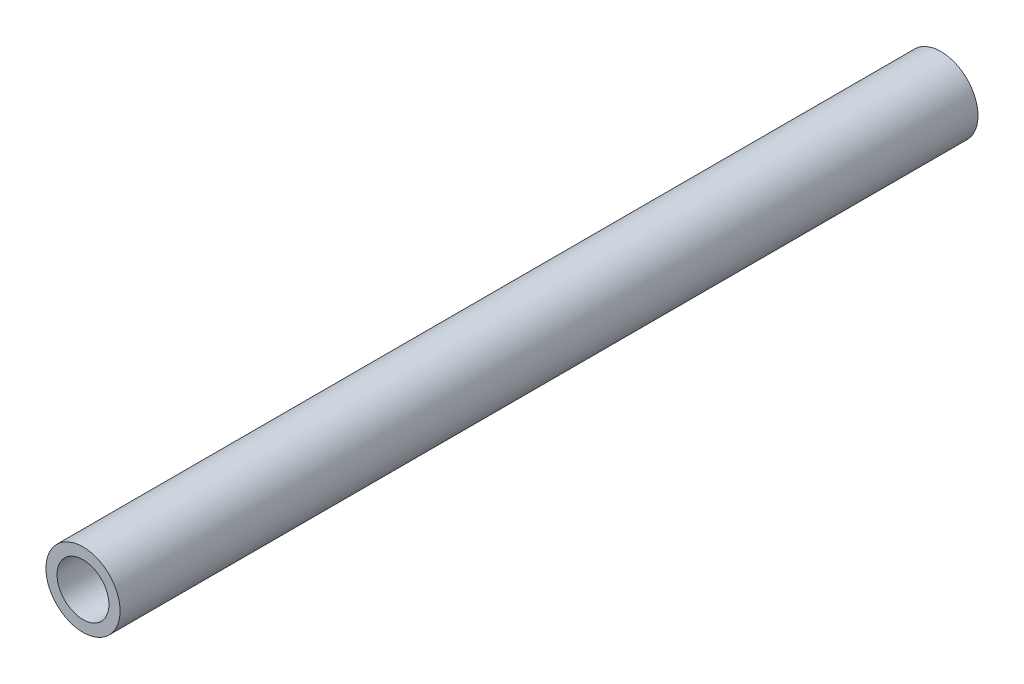
ISO-10303-21;
HEADER;
FILE_DESCRIPTION(('STEP AP214'),'2;1');
FILE_NAME('part.step','',(''),(''),'','','');
FILE_SCHEMA(('AUTOMOTIVE_DESIGN { 1 0 10303 214 1 1 1 1 }'));
ENDSEC;
DATA;
#1=APPLICATION_CONTEXT('core data for automotive mechanical design processes');
#2=APPLICATION_PROTOCOL_DEFINITION('international standard','automotive_design',2000,#1);
#3=PRODUCT_CONTEXT('',#1,'mechanical');
#4=PRODUCT('Part','Part','',(#3));
#5=PRODUCT_RELATED_PRODUCT_CATEGORY('part','',(#4));
#6=PRODUCT_DEFINITION_FORMATION('','',#4);
#7=PRODUCT_DEFINITION_CONTEXT('part definition',#1,'design');
#8=PRODUCT_DEFINITION('design','',#6,#7);
#9=PRODUCT_DEFINITION_SHAPE('','',#8);
#10=(LENGTH_UNIT() NAMED_UNIT(*) SI_UNIT(.MILLI.,.METRE.));
#11=(NAMED_UNIT(*) PLANE_ANGLE_UNIT() SI_UNIT($,.RADIAN.));
#12=(NAMED_UNIT(*) SI_UNIT($,.STERADIAN.) SOLID_ANGLE_UNIT());
#13=UNCERTAINTY_MEASURE_WITH_UNIT(LENGTH_MEASURE(1.E-05),#10,'distance_accuracy_value','');
#14=(GEOMETRIC_REPRESENTATION_CONTEXT(3) GLOBAL_UNCERTAINTY_ASSIGNED_CONTEXT((#13)) GLOBAL_UNIT_ASSIGNED_CONTEXT((#10,
#11,#12)) REPRESENTATION_CONTEXT('',''));
#15=CARTESIAN_POINT('',(0.,0.,0.));
#16=DIRECTION('',(0.,0.,1.));
#17=DIRECTION('',(1.,0.,0.));
#18=AXIS2_PLACEMENT_3D('',#15,#16,#17);
#19=CARTESIAN_POINT('',(0.,0.,294.));
#20=DIRECTION('',(0.,0.,-1.));
#21=DIRECTION('',(-1.,0.,0.));
#22=AXIS2_PLACEMENT_3D('',#19,#20,#21);
#23=CYLINDRICAL_SURFACE('',#22,12.7);
#24=CARTESIAN_POINT('',(0.,0.,294.));
#25=DIRECTION('',(0.,0.,1.));
#26=DIRECTION('',(1.,0.,0.));
#27=AXIS2_PLACEMENT_3D('',#24,#25,#26);
#28=CIRCLE('',#27,12.7);
#29=CARTESIAN_POINT('',(12.7,0.,294.));
#30=VERTEX_POINT('',#29);
#31=EDGE_CURVE('E10',#30,#30,#28,.T.);
#32=ORIENTED_EDGE('',*,*,#31,.F.);
#33=EDGE_LOOP('',(#32));
#34=FACE_BOUND('',#33,.T.);
#35=CARTESIAN_POINT('',(0.,0.,0.));
#36=DIRECTION('',(0.,0.,1.));
#37=DIRECTION('',(1.,0.,0.));
#38=AXIS2_PLACEMENT_3D('',#35,#36,#37);
#39=CIRCLE('',#38,12.7);
#40=CARTESIAN_POINT('',(12.7,0.,0.));
#41=VERTEX_POINT('',#40);
#42=EDGE_CURVE('E44',#41,#41,#39,.T.);
#43=ORIENTED_EDGE('',*,*,#42,.T.);
#44=EDGE_LOOP('',(#43));
#45=FACE_BOUND('',#44,.T.);
#46=ADVANCED_FACE('F41',(#34,#45),#23,.T.);
#47=CARTESIAN_POINT('',(0.,0.,294.));
#48=DIRECTION('',(0.,0.,1.));
#49=DIRECTION('',(1.,0.,0.));
#50=AXIS2_PLACEMENT_3D('',#47,#48,#49);
#51=PLANE('',#50);
#52=CARTESIAN_POINT('',(0.,0.,294.));
#53=DIRECTION('',(0.,0.,1.));
#54=DIRECTION('',(1.,0.,0.));
#55=AXIS2_PLACEMENT_3D('',#52,#53,#54);
#56=CIRCLE('',#55,8.89);
#57=CARTESIAN_POINT('',(8.89,0.,294.));
#58=VERTEX_POINT('',#57);
#59=EDGE_CURVE('E55',#58,#58,#56,.T.);
#60=ORIENTED_EDGE('',*,*,#59,.F.);
#61=EDGE_LOOP('',(#60));
#62=FACE_BOUND('',#61,.T.);
#63=ORIENTED_EDGE('',*,*,#31,.T.);
#64=EDGE_LOOP('',(#63));
#65=FACE_BOUND('',#64,.T.);
#66=ADVANCED_FACE('F72',(#62,#65),#51,.T.);
#67=CARTESIAN_POINT('',(0.,0.,0.));
#68=DIRECTION('',(0.,0.,1.));
#69=DIRECTION('',(1.,0.,0.));
#70=AXIS2_PLACEMENT_3D('',#67,#68,#69);
#71=PLANE('',#70);
#72=CARTESIAN_POINT('',(0.,0.,0.));
#73=DIRECTION('',(0.,0.,1.));
#74=DIRECTION('',(1.,0.,0.));
#75=AXIS2_PLACEMENT_3D('',#72,#73,#74);
#76=CIRCLE('',#75,8.89);
#77=CARTESIAN_POINT('',(8.89,0.,0.));
#78=VERTEX_POINT('',#77);
#79=EDGE_CURVE('E53',#78,#78,#76,.T.);
#80=ORIENTED_EDGE('',*,*,#79,.T.);
#81=EDGE_LOOP('',(#80));
#82=FACE_BOUND('',#81,.T.);
#83=ORIENTED_EDGE('',*,*,#42,.F.);
#84=EDGE_LOOP('',(#83));
#85=FACE_BOUND('',#84,.T.);
#86=ADVANCED_FACE('F63',(#82,#85),#71,.F.);
#87=CARTESIAN_POINT('',(0.,0.,0.));
#88=DIRECTION('',(0.,0.,1.));
#89=DIRECTION('',(1.,0.,0.));
#90=AXIS2_PLACEMENT_3D('',#87,#88,#89);
#91=CYLINDRICAL_SURFACE('',#90,8.89);
#92=ORIENTED_EDGE('',*,*,#79,.F.);
#93=EDGE_LOOP('',(#92));
#94=FACE_BOUND('',#93,.T.);
#95=ORIENTED_EDGE('',*,*,#59,.T.);
#96=EDGE_LOOP('',(#95));
#97=FACE_BOUND('',#96,.T.);
#98=ADVANCED_FACE('F66',(#94,#97),#91,.F.);
#99=CLOSED_SHELL('',(#46,#66,#86,#98));
#100=MANIFOLD_SOLID_BREP('B2',#99);
#101=ADVANCED_BREP_SHAPE_REPRESENTATION('',(#18,#100),#14);
#102=SHAPE_DEFINITION_REPRESENTATION(#9,#101);
ENDSEC;
END-ISO-10303-21;
